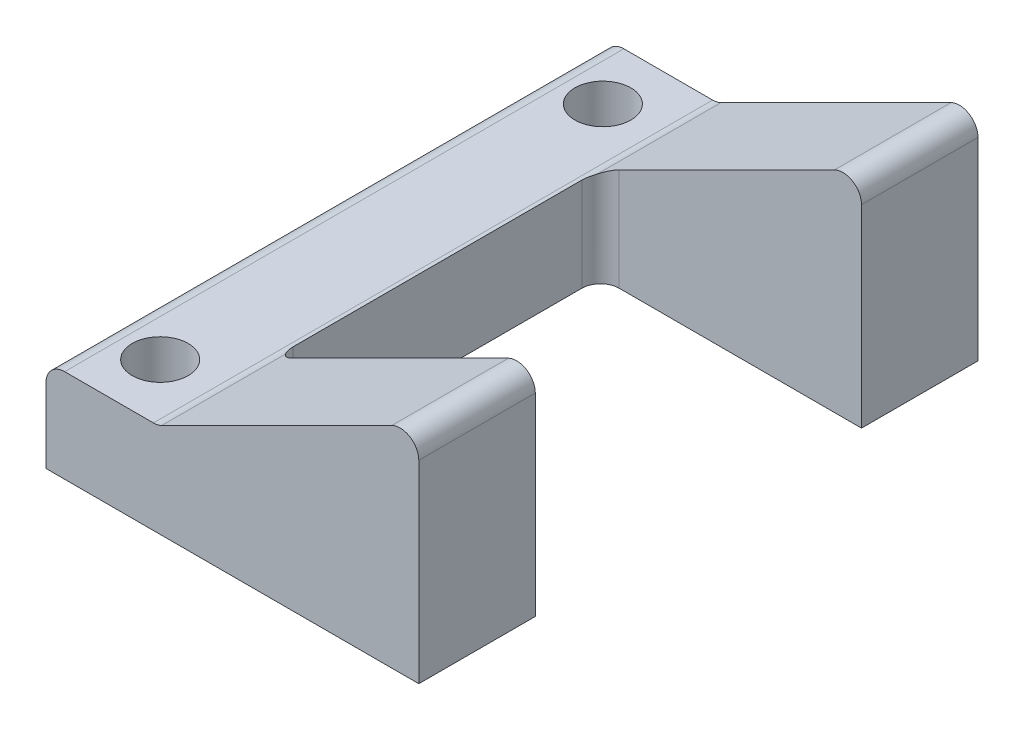
ISO-10303-21;
HEADER;
FILE_DESCRIPTION(('STEP AP214'),'2;1');
FILE_NAME('part.step','',(''),(''),'','','');
FILE_SCHEMA(('AUTOMOTIVE_DESIGN { 1 0 10303 214 1 1 1 1 }'));
ENDSEC;
DATA;
#1=APPLICATION_CONTEXT('core data for automotive mechanical design processes');
#2=APPLICATION_PROTOCOL_DEFINITION('international standard','automotive_design',2000,#1);
#3=PRODUCT_CONTEXT('',#1,'mechanical');
#4=PRODUCT('Part','Part','',(#3));
#5=PRODUCT_RELATED_PRODUCT_CATEGORY('part','',(#4));
#6=PRODUCT_DEFINITION_FORMATION('','',#4);
#7=PRODUCT_DEFINITION_CONTEXT('part definition',#1,'design');
#8=PRODUCT_DEFINITION('design','',#6,#7);
#9=PRODUCT_DEFINITION_SHAPE('','',#8);
#10=(LENGTH_UNIT() NAMED_UNIT(*) SI_UNIT(.MILLI.,.METRE.));
#11=(NAMED_UNIT(*) PLANE_ANGLE_UNIT() SI_UNIT($,.RADIAN.));
#12=(NAMED_UNIT(*) SI_UNIT($,.STERADIAN.) SOLID_ANGLE_UNIT());
#13=UNCERTAINTY_MEASURE_WITH_UNIT(LENGTH_MEASURE(1.E-05),#10,'distance_accuracy_value','');
#14=(GEOMETRIC_REPRESENTATION_CONTEXT(3) GLOBAL_UNCERTAINTY_ASSIGNED_CONTEXT((#13)) GLOBAL_UNIT_ASSIGNED_CONTEXT((#10,
#11,#12)) REPRESENTATION_CONTEXT('',''));
#15=CARTESIAN_POINT('',(0.,0.,0.));
#16=DIRECTION('',(0.,0.,1.));
#17=DIRECTION('',(1.,0.,0.));
#18=AXIS2_PLACEMENT_3D('',#15,#16,#17);
#19=CARTESIAN_POINT('',(20.,10.3819660112501,15.));
#20=DIRECTION('',(-1.,0.,0.));
#21=DIRECTION('',(0.,-1.,0.));
#22=AXIS2_PLACEMENT_3D('',#19,#20,#21);
#23=PLANE('',#22);
#24=DIRECTION('',(0.,0.,-1.));
#25=VECTOR('',#24,1.);
#26=CARTESIAN_POINT('',(20.,0.,15.));
#27=LINE('',#26,#25);
#28=CARTESIAN_POINT('',(20.,0.,15.));
#29=VERTEX_POINT('',#28);
#30=CARTESIAN_POINT('',(20.,0.,8.75));
#31=VERTEX_POINT('',#30);
#32=EDGE_CURVE('E203',#29,#31,#27,.T.);
#33=ORIENTED_EDGE('',*,*,#32,.T.);
#34=DIRECTION('',(0.,-1.,0.));
#35=VECTOR('',#34,1.);
#36=CARTESIAN_POINT('',(20.,30.,8.75));
#37=LINE('',#36,#35);
#38=CARTESIAN_POINT('',(20.,10.3819660112501,8.75));
#39=VERTEX_POINT('',#38);
#40=EDGE_CURVE('E370',#39,#31,#37,.T.);
#41=ORIENTED_EDGE('',*,*,#40,.F.);
#42=DIRECTION('',(0.,0.,-1.));
#43=VECTOR('',#42,1.);
#44=CARTESIAN_POINT('',(20.,10.3819660112501,15.));
#45=LINE('',#44,#43);
#46=CARTESIAN_POINT('',(20.,10.3819660112501,15.));
#47=VERTEX_POINT('',#46);
#48=EDGE_CURVE('E198',#47,#39,#45,.T.);
#49=ORIENTED_EDGE('',*,*,#48,.F.);
#50=DIRECTION('',(0.,1.,0.));
#51=VECTOR('',#50,1.);
#52=CARTESIAN_POINT('',(20.,10.3819660112501,15.));
#53=LINE('',#52,#51);
#54=EDGE_CURVE('E106',#29,#47,#53,.T.);
#55=ORIENTED_EDGE('',*,*,#54,.F.);
#56=EDGE_LOOP('',(#33,#41,#49,#55));
#57=FACE_BOUND('',#56,.T.);
#58=ADVANCED_FACE('F39',(#57),#23,.F.);
#59=CARTESIAN_POINT('',(19.,10.3819660112501,15.));
#60=DIRECTION('',(0.,0.,-1.));
#61=DIRECTION('',(-1.,0.,0.));
#62=AXIS2_PLACEMENT_3D('',#59,#60,#61);
#63=CYLINDRICAL_SURFACE('',#62,0.999999999999999);
#64=ORIENTED_EDGE('',*,*,#48,.T.);
#65=CARTESIAN_POINT('',(19.,10.3819660112501,8.75));
#66=DIRECTION('',(0.,0.,1.));
#67=DIRECTION('',(1.,0.,0.));
#68=AXIS2_PLACEMENT_3D('',#65,#66,#67);
#69=CIRCLE('',#68,0.999999999999999);
#70=CARTESIAN_POINT('',(18.5527864045,11.27639320225,8.75));
#71=VERTEX_POINT('',#70);
#72=EDGE_CURVE('E158',#39,#71,#69,.T.);
#73=ORIENTED_EDGE('',*,*,#72,.T.);
#74=DIRECTION('',(0.,0.,-1.));
#75=VECTOR('',#74,1.);
#76=CARTESIAN_POINT('',(18.5527864045,11.27639320225,15.));
#77=LINE('',#76,#75);
#78=CARTESIAN_POINT('',(18.5527864045,11.27639320225,15.));
#79=VERTEX_POINT('',#78);
#80=EDGE_CURVE('E193',#79,#71,#77,.T.);
#81=ORIENTED_EDGE('',*,*,#80,.F.);
#82=CARTESIAN_POINT('',(19.,10.3819660112501,15.));
#83=DIRECTION('',(0.,0.,1.));
#84=DIRECTION('',(-1.,0.,0.));
#85=AXIS2_PLACEMENT_3D('',#82,#83,#84);
#86=CIRCLE('',#85,0.999999999999999);
#87=EDGE_CURVE('E305',#47,#79,#86,.T.);
#88=ORIENTED_EDGE('',*,*,#87,.F.);
#89=EDGE_LOOP('',(#64,#73,#81,#88));
#90=FACE_BOUND('',#89,.T.);
#91=ADVANCED_FACE('F345',(#90),#63,.T.);
#92=CARTESIAN_POINT('',(6.21114561800017,5.10557280900008,15.));
#93=DIRECTION('',(0.447213595499958,-0.894427190999916,0.));
#94=DIRECTION('',(0.894427190999916,0.447213595499958,0.));
#95=AXIS2_PLACEMENT_3D('',#92,#93,#94);
#96=PLANE('',#95);
#97=DIRECTION('',(-0.894427190999916,-0.447213595499958,0.));
#98=VECTOR('',#97,1.);
#99=CARTESIAN_POINT('',(6.21114561800017,5.10557280900008,8.75));
#100=LINE('',#99,#98);
#101=CARTESIAN_POINT('',(7.00000000000001,5.50000000000001,8.75));
#102=VERTEX_POINT('',#101);
#103=EDGE_CURVE('E11',#71,#102,#100,.T.);
#104=ORIENTED_EDGE('',*,*,#103,.T.);
#105=CARTESIAN_POINT('',(7.,5.5,7.75));
#106=DIRECTION('',(0.447213595499958,-0.894427190999916,0.));
#107=DIRECTION('',(-0.894427190999916,-0.447213595499958,0.));
#108=AXIS2_PLACEMENT_3D('',#105,#106,#107);
#109=ELLIPSE('',#108,1.11803398874989,1.);
#110=CARTESIAN_POINT('',(6.21114561800017,5.10557280900008,8.36458015262426));
#111=VERTEX_POINT('',#110);
#112=EDGE_CURVE('E216',#102,#111,#109,.T.);
#113=ORIENTED_EDGE('',*,*,#112,.T.);
#114=DIRECTION('',(0.,0.,-1.));
#115=VECTOR('',#114,1.);
#116=CARTESIAN_POINT('',(6.21114561800017,5.10557280900008,15.));
#117=LINE('',#116,#115);
#118=CARTESIAN_POINT('',(6.21114561800017,5.10557280900008,15.));
#119=VERTEX_POINT('',#118);
#120=EDGE_CURVE('E188',#119,#111,#117,.T.);
#121=ORIENTED_EDGE('',*,*,#120,.F.);
#122=DIRECTION('',(-0.894427190999916,-0.447213595499958,0.));
#123=VECTOR('',#122,1.);
#124=CARTESIAN_POINT('',(6.21114561800017,5.10557280900008,15.));
#125=LINE('',#124,#123);
#126=EDGE_CURVE('E312',#79,#119,#125,.T.);
#127=ORIENTED_EDGE('',*,*,#126,.F.);
#128=ORIENTED_EDGE('',*,*,#80,.T.);
#129=EDGE_LOOP('',(#104,#113,#121,#127,#128));
#130=FACE_BOUND('',#129,.T.);
#131=ADVANCED_FACE('F321',(#130),#96,.F.);
#132=CARTESIAN_POINT('',(20.,0.,15.));
#133=DIRECTION('',(0.,1.,0.));
#134=DIRECTION('',(0.,0.,1.));
#135=AXIS2_PLACEMENT_3D('',#132,#133,#134);
#136=PLANE('',#135);
#137=CARTESIAN_POINT('',(3.,0.,11.875));
#138=DIRECTION('',(0.,-1.,0.));
#139=DIRECTION('',(1.,0.,0.));
#140=AXIS2_PLACEMENT_3D('',#137,#138,#139);
#141=CIRCLE('',#140,1.5);
#142=CARTESIAN_POINT('',(4.5,0.,11.875));
#143=VERTEX_POINT('',#142);
#144=EDGE_CURVE('E357',#143,#143,#141,.T.);
#145=ORIENTED_EDGE('',*,*,#144,.F.);
#146=EDGE_LOOP('',(#145));
#147=FACE_BOUND('',#146,.T.);
#148=CARTESIAN_POINT('',(3.,0.,-11.875));
#149=DIRECTION('',(0.,-1.,0.));
#150=DIRECTION('',(-1.,0.,0.));
#151=AXIS2_PLACEMENT_3D('',#148,#149,#150);
#152=CIRCLE('',#151,1.5);
#153=CARTESIAN_POINT('',(1.5,0.,-11.875));
#154=VERTEX_POINT('',#153);
#155=EDGE_CURVE('E353',#154,#154,#152,.T.);
#156=ORIENTED_EDGE('',*,*,#155,.F.);
#157=EDGE_LOOP('',(#156));
#158=FACE_BOUND('',#157,.T.);
#159=CARTESIAN_POINT('',(7.,0.,7.75));
#160=DIRECTION('',(0.,-1.,0.));
#161=DIRECTION('',(1.,0.,0.));
#162=AXIS2_PLACEMENT_3D('',#159,#160,#161);
#163=CIRCLE('',#162,1.);
#164=CARTESIAN_POINT('',(7.00000000000001,0.,8.75));
#165=VERTEX_POINT('',#164);
#166=CARTESIAN_POINT('',(6.,0.,7.74999999999999));
#167=VERTEX_POINT('',#166);
#168=EDGE_CURVE('E383',#165,#167,#163,.T.);
#169=ORIENTED_EDGE('',*,*,#168,.F.);
#170=DIRECTION('',(-1.,0.,0.));
#171=VECTOR('',#170,1.);
#172=CARTESIAN_POINT('',(20.,0.,8.75));
#173=LINE('',#172,#171);
#174=EDGE_CURVE('E386',#31,#165,#173,.T.);
#175=ORIENTED_EDGE('',*,*,#174,.F.);
#176=ORIENTED_EDGE('',*,*,#32,.F.);
#177=DIRECTION('',(1.,0.,0.));
#178=VECTOR('',#177,1.);
#179=CARTESIAN_POINT('',(20.,0.,15.));
#180=LINE('',#179,#178);
#181=CARTESIAN_POINT('',(0.,0.,15.));
#182=VERTEX_POINT('',#181);
#183=EDGE_CURVE('E180',#182,#29,#180,.T.);
#184=ORIENTED_EDGE('',*,*,#183,.F.);
#185=DIRECTION('',(0.,0.,-1.));
#186=VECTOR('',#185,1.);
#187=CARTESIAN_POINT('',(0.,0.,15.));
#188=LINE('',#187,#186);
#189=CARTESIAN_POINT('',(0.,0.,-15.));
#190=VERTEX_POINT('',#189);
#191=EDGE_CURVE('E149',#182,#190,#188,.T.);
#192=ORIENTED_EDGE('',*,*,#191,.T.);
#193=DIRECTION('',(1.,0.,0.));
#194=VECTOR('',#193,1.);
#195=CARTESIAN_POINT('',(20.,0.,-15.));
#196=LINE('',#195,#194);
#197=CARTESIAN_POINT('',(20.,0.,-15.));
#198=VERTEX_POINT('',#197);
#199=EDGE_CURVE('E153',#190,#198,#196,.T.);
#200=ORIENTED_EDGE('',*,*,#199,.T.);
#201=CARTESIAN_POINT('',(20.,0.,-8.75));
#202=VERTEX_POINT('',#201);
#203=EDGE_CURVE('E202',#202,#198,#27,.T.);
#204=ORIENTED_EDGE('',*,*,#203,.F.);
#205=DIRECTION('',(1.,0.,0.));
#206=VECTOR('',#205,1.);
#207=CARTESIAN_POINT('',(20.,0.,-8.75));
#208=LINE('',#207,#206);
#209=CARTESIAN_POINT('',(7.00000000000001,0.,-8.75));
#210=VERTEX_POINT('',#209);
#211=EDGE_CURVE('E389',#210,#202,#208,.T.);
#212=ORIENTED_EDGE('',*,*,#211,.F.);
#213=CARTESIAN_POINT('',(7.00000000000001,0.,-7.75));
#214=DIRECTION('',(0.,-1.,0.));
#215=DIRECTION('',(-1.,0.,0.));
#216=AXIS2_PLACEMENT_3D('',#213,#214,#215);
#217=CIRCLE('',#216,1.);
#218=CARTESIAN_POINT('',(6.00000000000001,0.,-7.75));
#219=VERTEX_POINT('',#218);
#220=EDGE_CURVE('E361',#219,#210,#217,.T.);
#221=ORIENTED_EDGE('',*,*,#220,.F.);
#222=DIRECTION('',(0.,0.,-1.));
#223=VECTOR('',#222,1.);
#224=CARTESIAN_POINT('',(6.,0.,7.74999999999999));
#225=LINE('',#224,#223);
#226=EDGE_CURVE('E366',#167,#219,#225,.T.);
#227=ORIENTED_EDGE('',*,*,#226,.F.);
#228=EDGE_LOOP('',(#169,#175,#176,#184,#192,#200,#204,#212,#221,#227));
#229=FACE_BOUND('',#228,.T.);
#230=ADVANCED_FACE('F41',(#147,#158,#229),#136,.F.);
#231=CARTESIAN_POINT('',(20.,10.3819660112501,-8.75));
#232=VERTEX_POINT('',#231);
#233=CARTESIAN_POINT('',(20.,10.3819660112501,-15.));
#234=VERTEX_POINT('',#233);
#235=EDGE_CURVE('E197',#232,#234,#45,.T.);
#236=ORIENTED_EDGE('',*,*,#235,.F.);
#237=DIRECTION('',(0.,-1.,0.));
#238=VECTOR('',#237,1.);
#239=CARTESIAN_POINT('',(20.,30.,-8.75));
#240=LINE('',#239,#238);
#241=EDGE_CURVE('E365',#232,#202,#240,.T.);
#242=ORIENTED_EDGE('',*,*,#241,.T.);
#243=ORIENTED_EDGE('',*,*,#203,.T.);
#244=DIRECTION('',(0.,1.,0.));
#245=VECTOR('',#244,1.);
#246=CARTESIAN_POINT('',(20.,10.3819660112501,-15.));
#247=LINE('',#246,#245);
#248=EDGE_CURVE('E157',#198,#234,#247,.T.);
#249=ORIENTED_EDGE('',*,*,#248,.T.);
#250=EDGE_LOOP('',(#236,#242,#243,#249));
#251=FACE_BOUND('',#250,.T.);
#252=ADVANCED_FACE('F406',(#251),#23,.F.);
#253=CARTESIAN_POINT('',(18.5527864045,11.27639320225,-8.75));
#254=VERTEX_POINT('',#253);
#255=CARTESIAN_POINT('',(18.5527864045,11.27639320225,-15.));
#256=VERTEX_POINT('',#255);
#257=EDGE_CURVE('E192',#254,#256,#77,.T.);
#258=ORIENTED_EDGE('',*,*,#257,.F.);
#259=CARTESIAN_POINT('',(19.,10.3819660112501,-8.75));
#260=DIRECTION('',(0.,0.,-1.));
#261=DIRECTION('',(-1.,0.,0.));
#262=AXIS2_PLACEMENT_3D('',#259,#260,#261);
#263=CIRCLE('',#262,0.999999999999999);
#264=EDGE_CURVE('E281',#254,#232,#263,.T.);
#265=ORIENTED_EDGE('',*,*,#264,.T.);
#266=ORIENTED_EDGE('',*,*,#235,.T.);
#267=CARTESIAN_POINT('',(19.,10.3819660112501,-15.));
#268=DIRECTION('',(0.,0.,1.));
#269=DIRECTION('',(-1.,0.,0.));
#270=AXIS2_PLACEMENT_3D('',#267,#268,#269);
#271=CIRCLE('',#270,0.999999999999999);
#272=EDGE_CURVE('E162',#234,#256,#271,.T.);
#273=ORIENTED_EDGE('',*,*,#272,.T.);
#274=EDGE_LOOP('',(#258,#265,#266,#273));
#275=FACE_BOUND('',#274,.T.);
#276=ADVANCED_FACE('F280',(#275),#63,.T.);
#277=CARTESIAN_POINT('',(6.21114561800017,5.10557280900008,-8.36458015262426));
#278=VERTEX_POINT('',#277);
#279=CARTESIAN_POINT('',(6.21114561800017,5.10557280900008,-15.));
#280=VERTEX_POINT('',#279);
#281=EDGE_CURVE('E187',#278,#280,#117,.T.);
#282=ORIENTED_EDGE('',*,*,#281,.F.);
#283=CARTESIAN_POINT('',(7.00000000000001,5.50000000000001,-7.75));
#284=DIRECTION('',(0.447213595499958,-0.894427190999916,0.));
#285=DIRECTION('',(-0.894427190999916,-0.447213595499958,0.));
#286=AXIS2_PLACEMENT_3D('',#283,#284,#285);
#287=ELLIPSE('',#286,1.11803398874989,1.);
#288=CARTESIAN_POINT('',(7.00000000000001,5.50000000000001,-8.75));
#289=VERTEX_POINT('',#288);
#290=EDGE_CURVE('E271',#278,#289,#287,.T.);
#291=ORIENTED_EDGE('',*,*,#290,.T.);
#292=DIRECTION('',(0.894427190999916,0.447213595499958,0.));
#293=VECTOR('',#292,1.);
#294=CARTESIAN_POINT('',(6.21114561800017,5.10557280900008,-8.75));
#295=LINE('',#294,#293);
#296=EDGE_CURVE('E48',#289,#254,#295,.T.);
#297=ORIENTED_EDGE('',*,*,#296,.T.);
#298=ORIENTED_EDGE('',*,*,#257,.T.);
#299=DIRECTION('',(-0.894427190999916,-0.447213595499958,0.));
#300=VECTOR('',#299,1.);
#301=CARTESIAN_POINT('',(6.21114561800017,5.10557280900008,-15.));
#302=LINE('',#301,#300);
#303=EDGE_CURVE('E166',#256,#280,#302,.T.);
#304=ORIENTED_EDGE('',*,*,#303,.T.);
#305=EDGE_LOOP('',(#282,#291,#297,#298,#304));
#306=FACE_BOUND('',#305,.T.);
#307=ADVANCED_FACE('F268',(#306),#96,.F.);
#308=CARTESIAN_POINT('',(5.76393202250021,6.,15.));
#309=DIRECTION('',(0.,0.,-1.));
#310=DIRECTION('',(-1.,0.,0.));
#311=AXIS2_PLACEMENT_3D('',#308,#309,#310);
#312=CYLINDRICAL_SURFACE('',#311,1.);
#313=DIRECTION('',(0.,0.,-1.));
#314=VECTOR('',#313,1.);
#315=CARTESIAN_POINT('',(6.,5.02826345648671,15.));
#316=LINE('',#315,#314);
#317=CARTESIAN_POINT('',(6.,5.02826345648667,7.75000000000001));
#318=VERTEX_POINT('',#317);
#319=CARTESIAN_POINT('',(6.00000000000001,5.02826345648671,-7.75));
#320=VERTEX_POINT('',#319);
#321=EDGE_CURVE('E226',#318,#320,#316,.T.);
#322=ORIENTED_EDGE('',*,*,#321,.T.);
#323=CARTESIAN_POINT('',(6.00000000000001,5.02826345648671,-7.75));
#324=CARTESIAN_POINT('',(6.00000108503513,5.02826991902766,-7.77696505629862));
#325=CARTESIAN_POINT('',(6.00109182975969,5.02852793022184,-7.8039138979491));
#326=CARTESIAN_POINT('',(6.00544245105983,5.02959802513672,-7.85762379533837));
#327=CARTESIAN_POINT('',(6.00870226155977,5.03041009197938,-7.88438485677237));
#328=CARTESIAN_POINT('',(6.02145621340975,5.03368607056726,-7.96253870131545));
#329=CARTESIAN_POINT('',(6.03393016862076,5.03698507158128,-8.01346016659564));
#330=CARTESIAN_POINT('',(6.05915548304621,5.04452844853154,-8.09004786055815));
#331=CARTESIAN_POINT('',(6.06924222634334,5.04767466086833,-8.11674261284329));
#332=CARTESIAN_POINT('',(6.0915906577913,5.05512992214839,-8.16904636658812));
#333=CARTESIAN_POINT('',(6.10385212636265,5.05943885371616,-8.19465547734061));
#334=CARTESIAN_POINT('',(6.13082435521559,5.06962116623138,-8.24536242237636));
#335=CARTESIAN_POINT('',(6.14560321410852,5.07554196995178,-8.27041465148558));
#336=CARTESIAN_POINT('',(6.17703826409949,5.08915728444144,-8.31883665333037));
#337=CARTESIAN_POINT('',(6.19369640019005,5.09685364161954,-8.34220464118096));
#338=CARTESIAN_POINT('',(6.21114561800017,5.10557280900006,-8.36458015262426));
#339=B_SPLINE_CURVE_WITH_KNOTS('',3,(#323,#324,#325,#326,#327,#328,#329,#330,#331,#332,#333,
#334,#335,#336,#337,#338),.UNSPECIFIED.,.F.,.F.,(4,2,2,2,2,2,2,4),(0.,0.0808392623134594,
0.161676062155883,0.318433486687678,0.404462158794646,0.490482149627477,0.579373660857239,
0.668358030943261),.UNSPECIFIED.);
#340=EDGE_CURVE('E253',#320,#278,#339,.T.);
#341=ORIENTED_EDGE('',*,*,#340,.T.);
#342=ORIENTED_EDGE('',*,*,#281,.T.);
#343=CARTESIAN_POINT('',(5.76393202250021,6.,-15.));
#344=DIRECTION('',(0.,0.,-1.));
#345=DIRECTION('',(1.,0.,0.));
#346=AXIS2_PLACEMENT_3D('',#343,#344,#345);
#347=CIRCLE('',#346,1.);
#348=CARTESIAN_POINT('',(5.76393202250021,5.,-15.));
#349=VERTEX_POINT('',#348);
#350=EDGE_CURVE('E170',#280,#349,#347,.T.);
#351=ORIENTED_EDGE('',*,*,#350,.T.);
#352=DIRECTION('',(0.,0.,-1.));
#353=VECTOR('',#352,1.);
#354=CARTESIAN_POINT('',(5.76393202250021,5.,15.));
#355=LINE('',#354,#353);
#356=CARTESIAN_POINT('',(5.76393202250021,5.,15.));
#357=VERTEX_POINT('',#356);
#358=EDGE_CURVE('E142',#357,#349,#355,.T.);
#359=ORIENTED_EDGE('',*,*,#358,.F.);
#360=CARTESIAN_POINT('',(5.76393202250021,6.,15.));
#361=DIRECTION('',(0.,0.,-1.));
#362=DIRECTION('',(1.,0.,0.));
#363=AXIS2_PLACEMENT_3D('',#360,#361,#362);
#364=CIRCLE('',#363,1.);
#365=EDGE_CURVE('E128',#119,#357,#364,.T.);
#366=ORIENTED_EDGE('',*,*,#365,.F.);
#367=ORIENTED_EDGE('',*,*,#120,.T.);
#368=CARTESIAN_POINT('',(6.21114561800017,5.10557280900008,8.36458015262426));
#369=CARTESIAN_POINT('',(6.19601330222527,5.09800845693931,8.34516443705304));
#370=CARTESIAN_POINT('',(6.18147328205301,5.09121603514318,8.32501343442704));
#371=CARTESIAN_POINT('',(6.15377674796541,5.0789949403185,8.28341226906747));
#372=CARTESIAN_POINT('',(6.14061919378394,5.07356523754805,8.26196310259966));
#373=CARTESIAN_POINT('',(6.10359252514132,5.05907733753005,8.19607065704866));
#374=CARTESIAN_POINT('',(6.08203472914427,5.05175788754173,8.14991098962576));
#375=CARTESIAN_POINT('',(6.04617062958198,5.04047108284208,8.05463482268548));
#376=CARTESIAN_POINT('',(6.031849288148,5.03649676516205,8.00552469420499));
#377=CARTESIAN_POINT('',(6.01084906834874,5.03090249191278,7.90553524856504));
#378=CARTESIAN_POINT('',(6.00417548191701,5.02928416638461,7.85465473142315));
#379=CARTESIAN_POINT('',(5.99855792319773,5.02790876896408,7.74990451012902));
#380=CARTESIAN_POINT('',(6.00001423095266,5.02824811057326,7.69601183270239));
#381=CARTESIAN_POINT('',(6.01155578463148,5.0311260799928,7.58917150923623));
#382=CARTESIAN_POINT('',(6.02164751516593,5.03366636057543,7.53622460391727));
#383=CARTESIAN_POINT('',(6.05030902489284,5.04176526720746,7.43212796237637));
#384=CARTESIAN_POINT('',(6.06899301128524,5.0473647505649,7.38101276598894));
#385=CARTESIAN_POINT('',(6.1140547189294,5.06299655945606,7.28311370511049));
#386=CARTESIAN_POINT('',(6.14040865557891,5.07301522983074,7.23631703097884));
#387=CARTESIAN_POINT('',(6.17638888055598,5.08899448460659,7.18271923694214));
#388=CARTESIAN_POINT('',(6.18314768702125,5.09208139668792,7.17303229022799));
#389=CARTESIAN_POINT('',(6.19694290835104,5.09857897010933,7.15398283237796));
#390=CARTESIAN_POINT('',(6.20397908928241,5.10198936190677,7.14462005984905));
#391=CARTESIAN_POINT('',(6.21114561800001,5.10557280899941,7.13541984737543));
#392=B_SPLINE_CURVE_WITH_KNOTS('',3,(#368,#369,#370,#371,#372,#373,#374,#375,#376,#377,#378,
#379,#380,#381,#382,#383,#384,#385,#386,#387,#388,#389,#390,#391),.UNSPECIFIED.,.F.,.F.,(4,2,2,
2,2,2,2,2,2,2,2,4),(0.,0.0771924162682057,0.154326325075832,0.307923476709058,0.461200116116118,
0.614582752765988,0.77558181497473,0.936701882647221,1.10002835327527,1.26285364712873,
1.29947195057452,1.33606000511459),.UNSPECIFIED.);
#393=EDGE_CURVE('E206',#111,#318,#392,.T.);
#394=ORIENTED_EDGE('',*,*,#393,.T.);
#395=EDGE_LOOP('',(#322,#341,#342,#351,#359,#366,#367,#394));
#396=FACE_BOUND('',#395,.T.);
#397=ADVANCED_FACE('F228',(#396),#312,.F.);
#398=CARTESIAN_POINT('',(1.00000000000001,5.,15.));
#399=DIRECTION('',(0.,-1.,0.));
#400=DIRECTION('',(1.,0.,0.));
#401=AXIS2_PLACEMENT_3D('',#398,#399,#400);
#402=PLANE('',#401);
#403=CARTESIAN_POINT('',(3.,5.,11.875));
#404=DIRECTION('',(0.,-1.,0.));
#405=DIRECTION('',(1.,0.,0.));
#406=AXIS2_PLACEMENT_3D('',#403,#404,#405);
#407=CIRCLE('',#406,1.5);
#408=CARTESIAN_POINT('',(4.5,5.,11.875));
#409=VERTEX_POINT('',#408);
#410=EDGE_CURVE('E211',#409,#409,#407,.T.);
#411=ORIENTED_EDGE('',*,*,#410,.T.);
#412=EDGE_LOOP('',(#411));
#413=FACE_BOUND('',#412,.T.);
#414=CARTESIAN_POINT('',(3.,5.,-11.875));
#415=DIRECTION('',(0.,-1.,0.));
#416=DIRECTION('',(1.,0.,0.));
#417=AXIS2_PLACEMENT_3D('',#414,#415,#416);
#418=CIRCLE('',#417,1.5);
#419=CARTESIAN_POINT('',(4.5,5.,-11.875));
#420=VERTEX_POINT('',#419);
#421=EDGE_CURVE('E207',#420,#420,#418,.T.);
#422=ORIENTED_EDGE('',*,*,#421,.T.);
#423=EDGE_LOOP('',(#422));
#424=FACE_BOUND('',#423,.T.);
#425=DIRECTION('',(-1.,0.,0.));
#426=VECTOR('',#425,1.);
#427=CARTESIAN_POINT('',(1.00000000000001,5.,-15.));
#428=LINE('',#427,#426);
#429=CARTESIAN_POINT('',(1.00000000000001,5.,-15.));
#430=VERTEX_POINT('',#429);
#431=EDGE_CURVE('E138',#349,#430,#428,.T.);
#432=ORIENTED_EDGE('',*,*,#431,.T.);
#433=DIRECTION('',(0.,0.,-1.));
#434=VECTOR('',#433,1.);
#435=CARTESIAN_POINT('',(1.00000000000001,5.,15.));
#436=LINE('',#435,#434);
#437=CARTESIAN_POINT('',(1.00000000000001,5.,15.));
#438=VERTEX_POINT('',#437);
#439=EDGE_CURVE('E135',#438,#430,#436,.T.);
#440=ORIENTED_EDGE('',*,*,#439,.F.);
#441=DIRECTION('',(-1.,0.,0.));
#442=VECTOR('',#441,1.);
#443=CARTESIAN_POINT('',(1.00000000000001,5.,15.));
#444=LINE('',#443,#442);
#445=EDGE_CURVE('E121',#357,#438,#444,.T.);
#446=ORIENTED_EDGE('',*,*,#445,.F.);
#447=ORIENTED_EDGE('',*,*,#358,.T.);
#448=EDGE_LOOP('',(#432,#440,#446,#447));
#449=FACE_BOUND('',#448,.T.);
#450=ADVANCED_FACE('F136',(#413,#424,#449),#402,.F.);
#451=CARTESIAN_POINT('',(1.,4.,15.));
#452=DIRECTION('',(0.,0.,-1.));
#453=DIRECTION('',(-1.,0.,0.));
#454=AXIS2_PLACEMENT_3D('',#451,#452,#453);
#455=CYLINDRICAL_SURFACE('',#454,1.);
#456=CARTESIAN_POINT('',(1.,4.,-15.));
#457=DIRECTION('',(0.,0.,1.));
#458=DIRECTION('',(-1.,0.,0.));
#459=AXIS2_PLACEMENT_3D('',#456,#457,#458);
#460=CIRCLE('',#459,1.);
#461=CARTESIAN_POINT('',(0.,3.99999999999999,-15.));
#462=VERTEX_POINT('',#461);
#463=EDGE_CURVE('E175',#430,#462,#460,.T.);
#464=ORIENTED_EDGE('',*,*,#463,.T.);
#465=DIRECTION('',(0.,0.,-1.));
#466=VECTOR('',#465,1.);
#467=CARTESIAN_POINT('',(0.,3.99999999999999,15.));
#468=LINE('',#467,#466);
#469=CARTESIAN_POINT('',(0.,3.99999999999999,15.));
#470=VERTEX_POINT('',#469);
#471=EDGE_CURVE('E143',#470,#462,#468,.T.);
#472=ORIENTED_EDGE('',*,*,#471,.F.);
#473=CARTESIAN_POINT('',(1.,4.,15.));
#474=DIRECTION('',(0.,0.,1.));
#475=DIRECTION('',(-1.,0.,0.));
#476=AXIS2_PLACEMENT_3D('',#473,#474,#475);
#477=CIRCLE('',#476,1.);
#478=EDGE_CURVE('E125',#438,#470,#477,.T.);
#479=ORIENTED_EDGE('',*,*,#478,.F.);
#480=ORIENTED_EDGE('',*,*,#439,.T.);
#481=EDGE_LOOP('',(#464,#472,#479,#480));
#482=FACE_BOUND('',#481,.T.);
#483=ADVANCED_FACE('F145',(#482),#455,.T.);
#484=CARTESIAN_POINT('',(0.,0.,15.));
#485=DIRECTION('',(1.,0.,0.));
#486=DIRECTION('',(0.,0.,-1.));
#487=AXIS2_PLACEMENT_3D('',#484,#485,#486);
#488=PLANE('',#487);
#489=DIRECTION('',(0.,-1.,0.));
#490=VECTOR('',#489,1.);
#491=CARTESIAN_POINT('',(0.,0.,-15.));
#492=LINE('',#491,#490);
#493=EDGE_CURVE('E97',#462,#190,#492,.T.);
#494=ORIENTED_EDGE('',*,*,#493,.T.);
#495=ORIENTED_EDGE('',*,*,#191,.F.);
#496=DIRECTION('',(0.,-1.,0.));
#497=VECTOR('',#496,1.);
#498=CARTESIAN_POINT('',(0.,0.,15.));
#499=LINE('',#498,#497);
#500=EDGE_CURVE('E64',#470,#182,#499,.T.);
#501=ORIENTED_EDGE('',*,*,#500,.F.);
#502=ORIENTED_EDGE('',*,*,#471,.T.);
#503=EDGE_LOOP('',(#494,#495,#501,#502));
#504=FACE_BOUND('',#503,.T.);
#505=ADVANCED_FACE('F296',(#504),#488,.F.);
#506=CARTESIAN_POINT('',(1.,4.,15.));
#507=DIRECTION('',(0.,0.,-1.));
#508=DIRECTION('',(-1.,0.,0.));
#509=AXIS2_PLACEMENT_3D('',#506,#507,#508);
#510=PLANE('',#509);
#511=ORIENTED_EDGE('',*,*,#183,.T.);
#512=ORIENTED_EDGE('',*,*,#54,.T.);
#513=ORIENTED_EDGE('',*,*,#87,.T.);
#514=ORIENTED_EDGE('',*,*,#126,.T.);
#515=ORIENTED_EDGE('',*,*,#365,.T.);
#516=ORIENTED_EDGE('',*,*,#445,.T.);
#517=ORIENTED_EDGE('',*,*,#478,.T.);
#518=ORIENTED_EDGE('',*,*,#500,.T.);
#519=EDGE_LOOP('',(#511,#512,#513,#514,#515,#516,#517,#518));
#520=FACE_BOUND('',#519,.T.);
#521=ADVANCED_FACE('F123',(#520),#510,.F.);
#522=CARTESIAN_POINT('',(1.,4.,-15.));
#523=DIRECTION('',(0.,0.,-1.));
#524=DIRECTION('',(-1.,0.,0.));
#525=AXIS2_PLACEMENT_3D('',#522,#523,#524);
#526=PLANE('',#525);
#527=ORIENTED_EDGE('',*,*,#199,.F.);
#528=ORIENTED_EDGE('',*,*,#493,.F.);
#529=ORIENTED_EDGE('',*,*,#463,.F.);
#530=ORIENTED_EDGE('',*,*,#431,.F.);
#531=ORIENTED_EDGE('',*,*,#350,.F.);
#532=ORIENTED_EDGE('',*,*,#303,.F.);
#533=ORIENTED_EDGE('',*,*,#272,.F.);
#534=ORIENTED_EDGE('',*,*,#248,.F.);
#535=EDGE_LOOP('',(#527,#528,#529,#530,#531,#532,#533,#534));
#536=FACE_BOUND('',#535,.T.);
#537=ADVANCED_FACE('F295',(#536),#526,.T.);
#538=CARTESIAN_POINT('',(3.,30.,-11.875));
#539=DIRECTION('',(0.,-1.,0.));
#540=DIRECTION('',(1.,0.,0.));
#541=AXIS2_PLACEMENT_3D('',#538,#539,#540);
#542=CYLINDRICAL_SURFACE('',#541,1.5);
#543=ORIENTED_EDGE('',*,*,#155,.T.);
#544=EDGE_LOOP('',(#543));
#545=FACE_BOUND('',#544,.T.);
#546=ORIENTED_EDGE('',*,*,#421,.F.);
#547=EDGE_LOOP('',(#546));
#548=FACE_BOUND('',#547,.T.);
#549=ADVANCED_FACE('F434',(#545,#548),#542,.F.);
#550=CARTESIAN_POINT('',(3.,30.,11.875));
#551=DIRECTION('',(0.,-1.,0.));
#552=DIRECTION('',(1.,0.,0.));
#553=AXIS2_PLACEMENT_3D('',#550,#551,#552);
#554=CYLINDRICAL_SURFACE('',#553,1.5);
#555=ORIENTED_EDGE('',*,*,#144,.T.);
#556=EDGE_LOOP('',(#555));
#557=FACE_BOUND('',#556,.T.);
#558=ORIENTED_EDGE('',*,*,#410,.F.);
#559=EDGE_LOOP('',(#558));
#560=FACE_BOUND('',#559,.T.);
#561=ADVANCED_FACE('F242',(#557,#560),#554,.F.);
#562=CARTESIAN_POINT('',(20.,30.,8.75));
#563=DIRECTION('',(0.,0.,1.));
#564=DIRECTION('',(1.,0.,0.));
#565=AXIS2_PLACEMENT_3D('',#562,#563,#564);
#566=PLANE('',#565);
#567=ORIENTED_EDGE('',*,*,#40,.T.);
#568=ORIENTED_EDGE('',*,*,#174,.T.);
#569=DIRECTION('',(0.,-1.,0.));
#570=VECTOR('',#569,1.);
#571=CARTESIAN_POINT('',(7.00000000000001,30.,8.75));
#572=LINE('',#571,#570);
#573=EDGE_CURVE('E343',#102,#165,#572,.T.);
#574=ORIENTED_EDGE('',*,*,#573,.F.);
#575=ORIENTED_EDGE('',*,*,#103,.F.);
#576=ORIENTED_EDGE('',*,*,#72,.F.);
#577=EDGE_LOOP('',(#567,#568,#574,#575,#576));
#578=FACE_BOUND('',#577,.T.);
#579=ADVANCED_FACE('F238',(#578),#566,.F.);
#580=CARTESIAN_POINT('',(20.,30.,-8.75));
#581=DIRECTION('',(0.,0.,-1.));
#582=DIRECTION('',(-1.,0.,0.));
#583=AXIS2_PLACEMENT_3D('',#580,#581,#582);
#584=PLANE('',#583);
#585=ORIENTED_EDGE('',*,*,#296,.F.);
#586=DIRECTION('',(0.,-1.,0.));
#587=VECTOR('',#586,1.);
#588=CARTESIAN_POINT('',(7.00000000000001,30.,-8.75));
#589=LINE('',#588,#587);
#590=EDGE_CURVE('E362',#289,#210,#589,.T.);
#591=ORIENTED_EDGE('',*,*,#590,.T.);
#592=ORIENTED_EDGE('',*,*,#211,.T.);
#593=ORIENTED_EDGE('',*,*,#241,.F.);
#594=ORIENTED_EDGE('',*,*,#264,.F.);
#595=EDGE_LOOP('',(#585,#591,#592,#593,#594));
#596=FACE_BOUND('',#595,.T.);
#597=ADVANCED_FACE('F241',(#596),#584,.F.);
#598=CARTESIAN_POINT('',(7.,30.,-7.75));
#599=DIRECTION('',(0.,-1.,0.));
#600=DIRECTION('',(1.,0.,0.));
#601=AXIS2_PLACEMENT_3D('',#598,#599,#600);
#602=CYLINDRICAL_SURFACE('',#601,1.);
#603=ORIENTED_EDGE('',*,*,#340,.F.);
#604=DIRECTION('',(0.,-1.,0.));
#605=VECTOR('',#604,1.);
#606=CARTESIAN_POINT('',(6.,30.,-7.75));
#607=LINE('',#606,#605);
#608=EDGE_CURVE('E212',#320,#219,#607,.T.);
#609=ORIENTED_EDGE('',*,*,#608,.T.);
#610=ORIENTED_EDGE('',*,*,#220,.T.);
#611=ORIENTED_EDGE('',*,*,#590,.F.);
#612=ORIENTED_EDGE('',*,*,#290,.F.);
#613=EDGE_LOOP('',(#603,#609,#610,#611,#612));
#614=FACE_BOUND('',#613,.T.);
#615=ADVANCED_FACE('F246',(#614),#602,.F.);
#616=CARTESIAN_POINT('',(6.,30.,7.74999999999999));
#617=DIRECTION('',(-1.,0.,0.));
#618=DIRECTION('',(0.,0.,1.));
#619=AXIS2_PLACEMENT_3D('',#616,#617,#618);
#620=PLANE('',#619);
#621=DIRECTION('',(0.,-1.,0.));
#622=VECTOR('',#621,1.);
#623=CARTESIAN_POINT('',(6.,30.,7.74999999999999));
#624=LINE('',#623,#622);
#625=EDGE_CURVE('E55',#318,#167,#624,.T.);
#626=ORIENTED_EDGE('',*,*,#625,.T.);
#627=ORIENTED_EDGE('',*,*,#226,.T.);
#628=ORIENTED_EDGE('',*,*,#608,.F.);
#629=ORIENTED_EDGE('',*,*,#321,.F.);
#630=EDGE_LOOP('',(#626,#627,#628,#629));
#631=FACE_BOUND('',#630,.T.);
#632=ADVANCED_FACE('F237',(#631),#620,.F.);
#633=CARTESIAN_POINT('',(7.,30.,7.75));
#634=DIRECTION('',(0.,-1.,0.));
#635=DIRECTION('',(1.,0.,0.));
#636=AXIS2_PLACEMENT_3D('',#633,#634,#635);
#637=CYLINDRICAL_SURFACE('',#636,1.);
#638=ORIENTED_EDGE('',*,*,#573,.T.);
#639=ORIENTED_EDGE('',*,*,#168,.T.);
#640=ORIENTED_EDGE('',*,*,#625,.F.);
#641=ORIENTED_EDGE('',*,*,#393,.F.);
#642=ORIENTED_EDGE('',*,*,#112,.F.);
#643=EDGE_LOOP('',(#638,#639,#640,#641,#642));
#644=FACE_BOUND('',#643,.T.);
#645=ADVANCED_FACE('F232',(#644),#637,.F.);
#646=CLOSED_SHELL('',(#58,#91,#131,#230,#252,#276,#307,#397,#450,#483,#505,#521,#537,#549,#561,
#579,#597,#615,#632,#645));
#647=MANIFOLD_SOLID_BREP('B2',#646);
#648=ADVANCED_BREP_SHAPE_REPRESENTATION('',(#18,#647),#14);
#649=SHAPE_DEFINITION_REPRESENTATION(#9,#648);
ENDSEC;
END-ISO-10303-21;
